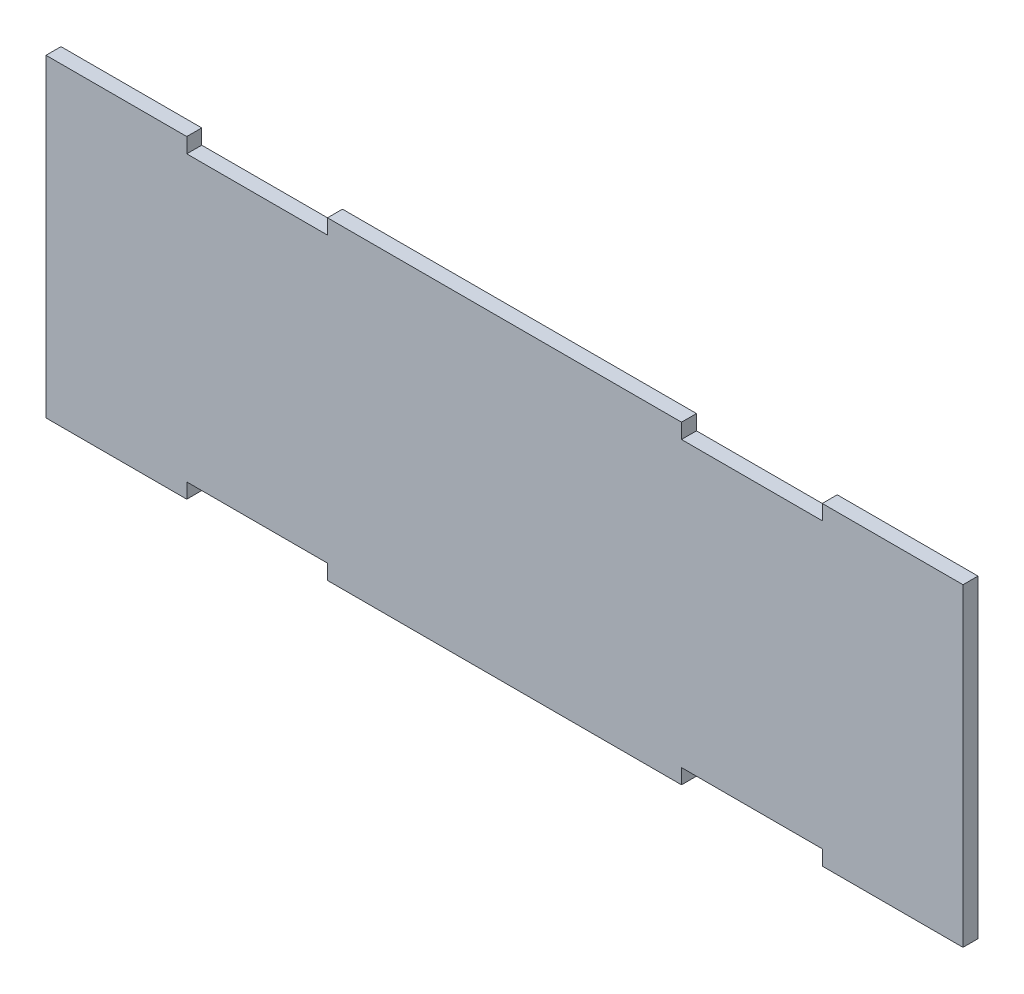
ISO-10303-21;
HEADER;
FILE_DESCRIPTION(('STEP AP214'),'2;1');
FILE_NAME('part.step','',(''),(''),'','','');
FILE_SCHEMA(('AUTOMOTIVE_DESIGN { 1 0 10303 214 1 1 1 1 }'));
ENDSEC;
DATA;
#1=APPLICATION_CONTEXT('core data for automotive mechanical design processes');
#2=APPLICATION_PROTOCOL_DEFINITION('international standard','automotive_design',2000,#1);
#3=PRODUCT_CONTEXT('',#1,'mechanical');
#4=PRODUCT('Part','Part','',(#3));
#5=PRODUCT_RELATED_PRODUCT_CATEGORY('part','',(#4));
#6=PRODUCT_DEFINITION_FORMATION('','',#4);
#7=PRODUCT_DEFINITION_CONTEXT('part definition',#1,'design');
#8=PRODUCT_DEFINITION('design','',#6,#7);
#9=PRODUCT_DEFINITION_SHAPE('','',#8);
#10=(LENGTH_UNIT() NAMED_UNIT(*) SI_UNIT(.MILLI.,.METRE.));
#11=(NAMED_UNIT(*) PLANE_ANGLE_UNIT() SI_UNIT($,.RADIAN.));
#12=(NAMED_UNIT(*) SI_UNIT($,.STERADIAN.) SOLID_ANGLE_UNIT());
#13=UNCERTAINTY_MEASURE_WITH_UNIT(LENGTH_MEASURE(1.E-05),#10,'distance_accuracy_value','');
#14=(GEOMETRIC_REPRESENTATION_CONTEXT(3) GLOBAL_UNCERTAINTY_ASSIGNED_CONTEXT((#13)) GLOBAL_UNIT_ASSIGNED_CONTEXT((#10,
#11,#12)) REPRESENTATION_CONTEXT('',''));
#15=CARTESIAN_POINT('',(0.,0.,0.));
#16=DIRECTION('',(0.,0.,1.));
#17=DIRECTION('',(1.,0.,0.));
#18=AXIS2_PLACEMENT_3D('',#15,#16,#17);
#19=CARTESIAN_POINT('',(-165.481,0.,5.4102));
#20=DIRECTION('',(-1.,0.,0.));
#21=DIRECTION('',(0.,-1.,0.));
#22=AXIS2_PLACEMENT_3D('',#19,#20,#21);
#23=PLANE('',#22);
#24=DIRECTION('',(0.,1.,0.));
#25=VECTOR('',#24,1.);
#26=CARTESIAN_POINT('',(-165.481,0.,0.));
#27=LINE('',#26,#25);
#28=CARTESIAN_POINT('',(-165.481,-56.680227,0.));
#29=VERTEX_POINT('',#28);
#30=CARTESIAN_POINT('',(-165.481,56.680227,0.));
#31=VERTEX_POINT('',#30);
#32=EDGE_CURVE('E202',#29,#31,#27,.T.);
#33=ORIENTED_EDGE('',*,*,#32,.F.);
#34=DIRECTION('',(0.,0.,-1.));
#35=VECTOR('',#34,1.);
#36=CARTESIAN_POINT('',(-165.481,-56.680227,5.4102));
#37=LINE('',#36,#35);
#38=CARTESIAN_POINT('',(-165.481,-56.680227,5.4102));
#39=VERTEX_POINT('',#38);
#40=EDGE_CURVE('E11',#39,#29,#37,.T.);
#41=ORIENTED_EDGE('',*,*,#40,.F.);
#42=DIRECTION('',(0.,1.,0.));
#43=VECTOR('',#42,1.);
#44=CARTESIAN_POINT('',(-165.481,0.,5.4102));
#45=LINE('',#44,#43);
#46=CARTESIAN_POINT('',(-165.481,56.680227,5.4102));
#47=VERTEX_POINT('',#46);
#48=EDGE_CURVE('E342',#39,#47,#45,.T.);
#49=ORIENTED_EDGE('',*,*,#48,.T.);
#50=DIRECTION('',(0.,0.,-1.));
#51=VECTOR('',#50,1.);
#52=CARTESIAN_POINT('',(-165.481,56.680227,5.4102));
#53=LINE('',#52,#51);
#54=EDGE_CURVE('E50',#47,#31,#53,.T.);
#55=ORIENTED_EDGE('',*,*,#54,.T.);
#56=EDGE_LOOP('',(#33,#41,#49,#55));
#57=FACE_BOUND('',#56,.T.);
#58=ADVANCED_FACE('F34',(#57),#23,.T.);
#59=CARTESIAN_POINT('',(0.,-56.680227,5.4102));
#60=DIRECTION('',(0.,1.,0.));
#61=DIRECTION('',(-1.,0.,0.));
#62=AXIS2_PLACEMENT_3D('',#59,#60,#61);
#63=PLANE('',#62);
#64=DIRECTION('',(1.,0.,0.));
#65=VECTOR('',#64,1.);
#66=CARTESIAN_POINT('',(0.,-56.680227,0.));
#67=LINE('',#66,#65);
#68=CARTESIAN_POINT('',(-114.681,-56.680227,0.));
#69=VERTEX_POINT('',#68);
#70=EDGE_CURVE('E204',#29,#69,#67,.T.);
#71=ORIENTED_EDGE('',*,*,#70,.T.);
#72=DIRECTION('',(0.,0.,-1.));
#73=VECTOR('',#72,1.);
#74=CARTESIAN_POINT('',(-114.681,-56.680227,5.4102));
#75=LINE('',#74,#73);
#76=CARTESIAN_POINT('',(-114.681,-56.680227,5.4102));
#77=VERTEX_POINT('',#76);
#78=EDGE_CURVE('E42',#77,#69,#75,.T.);
#79=ORIENTED_EDGE('',*,*,#78,.F.);
#80=DIRECTION('',(1.,0.,0.));
#81=VECTOR('',#80,1.);
#82=CARTESIAN_POINT('',(0.,-56.680227,5.4102));
#83=LINE('',#82,#81);
#84=EDGE_CURVE('E307',#39,#77,#83,.T.);
#85=ORIENTED_EDGE('',*,*,#84,.F.);
#86=ORIENTED_EDGE('',*,*,#40,.T.);
#87=EDGE_LOOP('',(#71,#79,#85,#86));
#88=FACE_BOUND('',#87,.T.);
#89=ADVANCED_FACE('F392',(#88),#63,.F.);
#90=CARTESIAN_POINT('',(-114.681,5.88340018331288E-13,5.4102));
#91=DIRECTION('',(-1.,0.,0.));
#92=DIRECTION('',(0.,-1.,0.));
#93=AXIS2_PLACEMENT_3D('',#90,#91,#92);
#94=PLANE('',#93);
#95=DIRECTION('',(0.,1.,0.));
#96=VECTOR('',#95,1.);
#97=CARTESIAN_POINT('',(-114.681,5.88340018331288E-13,0.));
#98=LINE('',#97,#96);
#99=CARTESIAN_POINT('',(-114.681,-51.270027,0.));
#100=VERTEX_POINT('',#99);
#101=EDGE_CURVE('E206',#69,#100,#98,.T.);
#102=ORIENTED_EDGE('',*,*,#101,.T.);
#103=DIRECTION('',(0.,0.,-1.));
#104=VECTOR('',#103,1.);
#105=CARTESIAN_POINT('',(-114.681,-51.270027,5.4102));
#106=LINE('',#105,#104);
#107=CARTESIAN_POINT('',(-114.681,-51.270027,5.4102));
#108=VERTEX_POINT('',#107);
#109=EDGE_CURVE('E279',#108,#100,#106,.T.);
#110=ORIENTED_EDGE('',*,*,#109,.F.);
#111=DIRECTION('',(0.,1.,0.));
#112=VECTOR('',#111,1.);
#113=CARTESIAN_POINT('',(-114.681,5.88340018331288E-13,5.4102));
#114=LINE('',#113,#112);
#115=EDGE_CURVE('E288',#77,#108,#114,.T.);
#116=ORIENTED_EDGE('',*,*,#115,.F.);
#117=ORIENTED_EDGE('',*,*,#78,.T.);
#118=EDGE_LOOP('',(#102,#110,#116,#117));
#119=FACE_BOUND('',#118,.T.);
#120=ADVANCED_FACE('F286',(#119),#94,.F.);
#121=CARTESIAN_POINT('',(0.,-51.270027,5.4102));
#122=DIRECTION('',(0.,1.,0.));
#123=DIRECTION('',(-1.,0.,0.));
#124=AXIS2_PLACEMENT_3D('',#121,#122,#123);
#125=PLANE('',#124);
#126=DIRECTION('',(1.,0.,0.));
#127=VECTOR('',#126,1.);
#128=CARTESIAN_POINT('',(0.,-51.270027,0.));
#129=LINE('',#128,#127);
#130=CARTESIAN_POINT('',(-63.881,-51.270027,0.));
#131=VERTEX_POINT('',#130);
#132=EDGE_CURVE('E210',#100,#131,#129,.T.);
#133=ORIENTED_EDGE('',*,*,#132,.T.);
#134=DIRECTION('',(0.,0.,-1.));
#135=VECTOR('',#134,1.);
#136=CARTESIAN_POINT('',(-63.881,-51.270027,5.4102));
#137=LINE('',#136,#135);
#138=CARTESIAN_POINT('',(-63.881,-51.270027,5.4102));
#139=VERTEX_POINT('',#138);
#140=EDGE_CURVE('E277',#139,#131,#137,.T.);
#141=ORIENTED_EDGE('',*,*,#140,.F.);
#142=DIRECTION('',(1.,0.,0.));
#143=VECTOR('',#142,1.);
#144=CARTESIAN_POINT('',(0.,-51.270027,5.4102));
#145=LINE('',#144,#143);
#146=EDGE_CURVE('E301',#108,#139,#145,.T.);
#147=ORIENTED_EDGE('',*,*,#146,.F.);
#148=ORIENTED_EDGE('',*,*,#109,.T.);
#149=EDGE_LOOP('',(#133,#141,#147,#148));
#150=FACE_BOUND('',#149,.T.);
#151=ADVANCED_FACE('F298',(#150),#125,.F.);
#152=CARTESIAN_POINT('',(-63.8809999999998,1.63862142425602E-13,5.4102));
#153=DIRECTION('',(-1.,0.,0.));
#154=DIRECTION('',(0.,-1.,0.));
#155=AXIS2_PLACEMENT_3D('',#152,#153,#154);
#156=PLANE('',#155);
#157=DIRECTION('',(0.,1.,0.));
#158=VECTOR('',#157,1.);
#159=CARTESIAN_POINT('',(-63.8809999999998,1.63862142425602E-13,0.));
#160=LINE('',#159,#158);
#161=CARTESIAN_POINT('',(-63.881,-56.680227,0.));
#162=VERTEX_POINT('',#161);
#163=EDGE_CURVE('E213',#162,#131,#160,.T.);
#164=ORIENTED_EDGE('',*,*,#163,.F.);
#165=DIRECTION('',(0.,0.,-1.));
#166=VECTOR('',#165,1.);
#167=CARTESIAN_POINT('',(-63.881,-56.680227,5.4102));
#168=LINE('',#167,#166);
#169=CARTESIAN_POINT('',(-63.881,-56.680227,5.4102));
#170=VERTEX_POINT('',#169);
#171=EDGE_CURVE('E275',#170,#162,#168,.T.);
#172=ORIENTED_EDGE('',*,*,#171,.F.);
#173=DIRECTION('',(0.,1.,0.));
#174=VECTOR('',#173,1.);
#175=CARTESIAN_POINT('',(-63.8809999999998,1.63862142425602E-13,5.4102));
#176=LINE('',#175,#174);
#177=EDGE_CURVE('E303',#170,#139,#176,.T.);
#178=ORIENTED_EDGE('',*,*,#177,.T.);
#179=ORIENTED_EDGE('',*,*,#140,.T.);
#180=EDGE_LOOP('',(#164,#172,#178,#179));
#181=FACE_BOUND('',#180,.T.);
#182=ADVANCED_FACE('F384',(#181),#156,.T.);
#183=CARTESIAN_POINT('',(63.881,-56.680227,0.));
#184=VERTEX_POINT('',#183);
#185=EDGE_CURVE('E208',#162,#184,#67,.T.);
#186=ORIENTED_EDGE('',*,*,#185,.T.);
#187=DIRECTION('',(0.,0.,-1.));
#188=VECTOR('',#187,1.);
#189=CARTESIAN_POINT('',(63.881,-56.680227,5.4102));
#190=LINE('',#189,#188);
#191=CARTESIAN_POINT('',(63.881,-56.680227,5.4102));
#192=VERTEX_POINT('',#191);
#193=EDGE_CURVE('E272',#192,#184,#190,.T.);
#194=ORIENTED_EDGE('',*,*,#193,.F.);
#195=EDGE_CURVE('E305',#170,#192,#83,.T.);
#196=ORIENTED_EDGE('',*,*,#195,.F.);
#197=ORIENTED_EDGE('',*,*,#171,.T.);
#198=EDGE_LOOP('',(#186,#194,#196,#197));
#199=FACE_BOUND('',#198,.T.);
#200=ADVANCED_FACE('F349',(#199),#63,.F.);
#201=CARTESIAN_POINT('',(63.8809999999998,1.63862142425603E-13,5.4102));
#202=DIRECTION('',(-1.,0.,0.));
#203=DIRECTION('',(0.,-1.,0.));
#204=AXIS2_PLACEMENT_3D('',#201,#202,#203);
#205=PLANE('',#204);
#206=DIRECTION('',(0.,1.,0.));
#207=VECTOR('',#206,1.);
#208=CARTESIAN_POINT('',(63.8809999999998,1.63862142425603E-13,0.));
#209=LINE('',#208,#207);
#210=CARTESIAN_POINT('',(63.881,-51.270027,0.));
#211=VERTEX_POINT('',#210);
#212=EDGE_CURVE('E216',#184,#211,#209,.T.);
#213=ORIENTED_EDGE('',*,*,#212,.T.);
#214=DIRECTION('',(0.,0.,-1.));
#215=VECTOR('',#214,1.);
#216=CARTESIAN_POINT('',(63.881,-51.270027,5.4102));
#217=LINE('',#216,#215);
#218=CARTESIAN_POINT('',(63.881,-51.270027,5.4102));
#219=VERTEX_POINT('',#218);
#220=EDGE_CURVE('E269',#219,#211,#217,.T.);
#221=ORIENTED_EDGE('',*,*,#220,.F.);
#222=DIRECTION('',(0.,1.,0.));
#223=VECTOR('',#222,1.);
#224=CARTESIAN_POINT('',(63.8809999999998,1.63862142425603E-13,5.4102));
#225=LINE('',#224,#223);
#226=EDGE_CURVE('E311',#192,#219,#225,.T.);
#227=ORIENTED_EDGE('',*,*,#226,.F.);
#228=ORIENTED_EDGE('',*,*,#193,.T.);
#229=EDGE_LOOP('',(#213,#221,#227,#228));
#230=FACE_BOUND('',#229,.T.);
#231=ADVANCED_FACE('F352',(#230),#205,.F.);
#232=CARTESIAN_POINT('',(0.,-51.270027,5.4102));
#233=DIRECTION('',(0.,1.,0.));
#234=DIRECTION('',(-1.,0.,0.));
#235=AXIS2_PLACEMENT_3D('',#232,#233,#234);
#236=PLANE('',#235);
#237=DIRECTION('',(1.,0.,0.));
#238=VECTOR('',#237,1.);
#239=CARTESIAN_POINT('',(0.,-51.270027,0.));
#240=LINE('',#239,#238);
#241=CARTESIAN_POINT('',(114.681,-51.270027,0.));
#242=VERTEX_POINT('',#241);
#243=EDGE_CURVE('E218',#211,#242,#240,.T.);
#244=ORIENTED_EDGE('',*,*,#243,.T.);
#245=DIRECTION('',(0.,0.,-1.));
#246=VECTOR('',#245,1.);
#247=CARTESIAN_POINT('',(114.681,-51.270027,5.4102));
#248=LINE('',#247,#246);
#249=CARTESIAN_POINT('',(114.681,-51.270027,5.4102));
#250=VERTEX_POINT('',#249);
#251=EDGE_CURVE('E267',#250,#242,#248,.T.);
#252=ORIENTED_EDGE('',*,*,#251,.F.);
#253=DIRECTION('',(1.,0.,0.));
#254=VECTOR('',#253,1.);
#255=CARTESIAN_POINT('',(0.,-51.270027,5.4102));
#256=LINE('',#255,#254);
#257=EDGE_CURVE('E313',#219,#250,#256,.T.);
#258=ORIENTED_EDGE('',*,*,#257,.F.);
#259=ORIENTED_EDGE('',*,*,#220,.T.);
#260=EDGE_LOOP('',(#244,#252,#258,#259));
#261=FACE_BOUND('',#260,.T.);
#262=ADVANCED_FACE('F357',(#261),#236,.F.);
#263=CARTESIAN_POINT('',(114.681,2.94170009165644E-13,5.4102));
#264=DIRECTION('',(-1.,0.,0.));
#265=DIRECTION('',(0.,-1.,0.));
#266=AXIS2_PLACEMENT_3D('',#263,#264,#265);
#267=PLANE('',#266);
#268=DIRECTION('',(0.,1.,0.));
#269=VECTOR('',#268,1.);
#270=CARTESIAN_POINT('',(114.681,2.94170009165644E-13,0.));
#271=LINE('',#270,#269);
#272=CARTESIAN_POINT('',(114.681,-56.680227,0.));
#273=VERTEX_POINT('',#272);
#274=EDGE_CURVE('E221',#273,#242,#271,.T.);
#275=ORIENTED_EDGE('',*,*,#274,.F.);
#276=DIRECTION('',(0.,0.,-1.));
#277=VECTOR('',#276,1.);
#278=CARTESIAN_POINT('',(114.681,-56.680227,5.4102));
#279=LINE('',#278,#277);
#280=CARTESIAN_POINT('',(114.681,-56.680227,5.4102));
#281=VERTEX_POINT('',#280);
#282=EDGE_CURVE('E265',#281,#273,#279,.T.);
#283=ORIENTED_EDGE('',*,*,#282,.F.);
#284=DIRECTION('',(0.,1.,0.));
#285=VECTOR('',#284,1.);
#286=CARTESIAN_POINT('',(114.681,2.94170009165644E-13,5.4102));
#287=LINE('',#286,#285);
#288=EDGE_CURVE('E315',#281,#250,#287,.T.);
#289=ORIENTED_EDGE('',*,*,#288,.T.);
#290=ORIENTED_EDGE('',*,*,#251,.T.);
#291=EDGE_LOOP('',(#275,#283,#289,#290));
#292=FACE_BOUND('',#291,.T.);
#293=ADVANCED_FACE('F363',(#292),#267,.T.);
#294=CARTESIAN_POINT('',(165.481,-56.680227,0.));
#295=VERTEX_POINT('',#294);
#296=EDGE_CURVE('E207',#273,#295,#67,.T.);
#297=ORIENTED_EDGE('',*,*,#296,.T.);
#298=DIRECTION('',(0.,0.,-1.));
#299=VECTOR('',#298,1.);
#300=CARTESIAN_POINT('',(165.481,-56.680227,5.4102));
#301=LINE('',#300,#299);
#302=CARTESIAN_POINT('',(165.481,-56.680227,5.4102));
#303=VERTEX_POINT('',#302);
#304=EDGE_CURVE('E262',#303,#295,#301,.T.);
#305=ORIENTED_EDGE('',*,*,#304,.F.);
#306=EDGE_CURVE('E318',#281,#303,#83,.T.);
#307=ORIENTED_EDGE('',*,*,#306,.F.);
#308=ORIENTED_EDGE('',*,*,#282,.T.);
#309=EDGE_LOOP('',(#297,#305,#307,#308));
#310=FACE_BOUND('',#309,.T.);
#311=ADVANCED_FACE('F366',(#310),#63,.F.);
#312=CARTESIAN_POINT('',(165.481,0.,5.4102));
#313=DIRECTION('',(-1.,0.,0.));
#314=DIRECTION('',(0.,-1.,0.));
#315=AXIS2_PLACEMENT_3D('',#312,#313,#314);
#316=PLANE('',#315);
#317=DIRECTION('',(0.,1.,0.));
#318=VECTOR('',#317,1.);
#319=CARTESIAN_POINT('',(165.481,0.,0.));
#320=LINE('',#319,#318);
#321=CARTESIAN_POINT('',(165.481,56.680227,0.));
#322=VERTEX_POINT('',#321);
#323=EDGE_CURVE('E224',#295,#322,#320,.T.);
#324=ORIENTED_EDGE('',*,*,#323,.T.);
#325=DIRECTION('',(0.,0.,-1.));
#326=VECTOR('',#325,1.);
#327=CARTESIAN_POINT('',(165.481,56.680227,5.4102));
#328=LINE('',#327,#326);
#329=CARTESIAN_POINT('',(165.481,56.680227,5.4102));
#330=VERTEX_POINT('',#329);
#331=EDGE_CURVE('E260',#330,#322,#328,.T.);
#332=ORIENTED_EDGE('',*,*,#331,.F.);
#333=DIRECTION('',(0.,1.,0.));
#334=VECTOR('',#333,1.);
#335=CARTESIAN_POINT('',(165.481,0.,5.4102));
#336=LINE('',#335,#334);
#337=EDGE_CURVE('E319',#303,#330,#336,.T.);
#338=ORIENTED_EDGE('',*,*,#337,.F.);
#339=ORIENTED_EDGE('',*,*,#304,.T.);
#340=EDGE_LOOP('',(#324,#332,#338,#339));
#341=FACE_BOUND('',#340,.T.);
#342=ADVANCED_FACE('F371',(#341),#316,.F.);
#343=CARTESIAN_POINT('',(0.,56.680227,5.4102));
#344=DIRECTION('',(0.,1.,0.));
#345=DIRECTION('',(0.,0.,1.));
#346=AXIS2_PLACEMENT_3D('',#343,#344,#345);
#347=PLANE('',#346);
#348=DIRECTION('',(1.,0.,0.));
#349=VECTOR('',#348,1.);
#350=CARTESIAN_POINT('',(0.,56.680227,0.));
#351=LINE('',#350,#349);
#352=CARTESIAN_POINT('',(114.681,56.680227,0.));
#353=VERTEX_POINT('',#352);
#354=EDGE_CURVE('E227',#353,#322,#351,.T.);
#355=ORIENTED_EDGE('',*,*,#354,.F.);
#356=DIRECTION('',(0.,0.,-1.));
#357=VECTOR('',#356,1.);
#358=CARTESIAN_POINT('',(114.681,56.680227,5.4102));
#359=LINE('',#358,#357);
#360=CARTESIAN_POINT('',(114.681,56.680227,5.4102));
#361=VERTEX_POINT('',#360);
#362=EDGE_CURVE('E258',#361,#353,#359,.T.);
#363=ORIENTED_EDGE('',*,*,#362,.F.);
#364=DIRECTION('',(1.,0.,0.));
#365=VECTOR('',#364,1.);
#366=CARTESIAN_POINT('',(0.,56.680227,5.4102));
#367=LINE('',#366,#365);
#368=EDGE_CURVE('E199',#361,#330,#367,.T.);
#369=ORIENTED_EDGE('',*,*,#368,.T.);
#370=ORIENTED_EDGE('',*,*,#331,.T.);
#371=EDGE_LOOP('',(#355,#363,#369,#370));
#372=FACE_BOUND('',#371,.T.);
#373=ADVANCED_FACE('F377',(#372),#347,.T.);
#374=CARTESIAN_POINT('',(114.681,-2.94170009165644E-13,5.4102));
#375=DIRECTION('',(1.,0.,0.));
#376=DIRECTION('',(0.,1.,0.));
#377=AXIS2_PLACEMENT_3D('',#374,#375,#376);
#378=PLANE('',#377);
#379=DIRECTION('',(0.,-1.,0.));
#380=VECTOR('',#379,1.);
#381=CARTESIAN_POINT('',(114.681,-2.94170009165644E-13,0.));
#382=LINE('',#381,#380);
#383=CARTESIAN_POINT('',(114.681,51.270027,0.));
#384=VERTEX_POINT('',#383);
#385=EDGE_CURVE('E230',#353,#384,#382,.T.);
#386=ORIENTED_EDGE('',*,*,#385,.T.);
#387=DIRECTION('',(0.,0.,-1.));
#388=VECTOR('',#387,1.);
#389=CARTESIAN_POINT('',(114.681,51.270027,5.4102));
#390=LINE('',#389,#388);
#391=CARTESIAN_POINT('',(114.681,51.270027,5.4102));
#392=VERTEX_POINT('',#391);
#393=EDGE_CURVE('E256',#392,#384,#390,.T.);
#394=ORIENTED_EDGE('',*,*,#393,.F.);
#395=DIRECTION('',(0.,-1.,0.));
#396=VECTOR('',#395,1.);
#397=CARTESIAN_POINT('',(114.681,-2.94170009165644E-13,5.4102));
#398=LINE('',#397,#396);
#399=EDGE_CURVE('E322',#361,#392,#398,.T.);
#400=ORIENTED_EDGE('',*,*,#399,.F.);
#401=ORIENTED_EDGE('',*,*,#362,.T.);
#402=EDGE_LOOP('',(#386,#394,#400,#401));
#403=FACE_BOUND('',#402,.T.);
#404=ADVANCED_FACE('F380',(#403),#378,.F.);
#405=CARTESIAN_POINT('',(0.,51.270027,5.4102));
#406=DIRECTION('',(0.,1.,0.));
#407=DIRECTION('',(-1.,0.,0.));
#408=AXIS2_PLACEMENT_3D('',#405,#406,#407);
#409=PLANE('',#408);
#410=DIRECTION('',(1.,0.,0.));
#411=VECTOR('',#410,1.);
#412=CARTESIAN_POINT('',(0.,51.270027,0.));
#413=LINE('',#412,#411);
#414=CARTESIAN_POINT('',(63.881,51.270027,0.));
#415=VERTEX_POINT('',#414);
#416=EDGE_CURVE('E235',#415,#384,#413,.T.);
#417=ORIENTED_EDGE('',*,*,#416,.F.);
#418=DIRECTION('',(0.,0.,-1.));
#419=VECTOR('',#418,1.);
#420=CARTESIAN_POINT('',(63.881,51.270027,5.4102));
#421=LINE('',#420,#419);
#422=CARTESIAN_POINT('',(63.881,51.270027,5.4102));
#423=VERTEX_POINT('',#422);
#424=EDGE_CURVE('E254',#423,#415,#421,.T.);
#425=ORIENTED_EDGE('',*,*,#424,.F.);
#426=DIRECTION('',(1.,0.,0.));
#427=VECTOR('',#426,1.);
#428=CARTESIAN_POINT('',(0.,51.270027,5.4102));
#429=LINE('',#428,#427);
#430=EDGE_CURVE('E324',#423,#392,#429,.T.);
#431=ORIENTED_EDGE('',*,*,#430,.T.);
#432=ORIENTED_EDGE('',*,*,#393,.T.);
#433=EDGE_LOOP('',(#417,#425,#431,#432));
#434=FACE_BOUND('',#433,.T.);
#435=ADVANCED_FACE('F382',(#434),#409,.T.);
#436=CARTESIAN_POINT('',(63.8809999999998,-1.63862142425603E-13,5.4102));
#437=DIRECTION('',(1.,0.,0.));
#438=DIRECTION('',(0.,1.,0.));
#439=AXIS2_PLACEMENT_3D('',#436,#437,#438);
#440=PLANE('',#439);
#441=DIRECTION('',(0.,-1.,0.));
#442=VECTOR('',#441,1.);
#443=CARTESIAN_POINT('',(63.8809999999998,-1.63862142425603E-13,0.));
#444=LINE('',#443,#442);
#445=CARTESIAN_POINT('',(63.881,56.680227,0.));
#446=VERTEX_POINT('',#445);
#447=EDGE_CURVE('E238',#446,#415,#444,.T.);
#448=ORIENTED_EDGE('',*,*,#447,.F.);
#449=DIRECTION('',(0.,0.,-1.));
#450=VECTOR('',#449,1.);
#451=CARTESIAN_POINT('',(63.881,56.680227,5.4102));
#452=LINE('',#451,#450);
#453=CARTESIAN_POINT('',(63.881,56.680227,5.4102));
#454=VERTEX_POINT('',#453);
#455=EDGE_CURVE('E252',#454,#446,#452,.T.);
#456=ORIENTED_EDGE('',*,*,#455,.F.);
#457=DIRECTION('',(0.,-1.,0.));
#458=VECTOR('',#457,1.);
#459=CARTESIAN_POINT('',(63.8809999999998,-1.63862142425603E-13,5.4102));
#460=LINE('',#459,#458);
#461=EDGE_CURVE('E327',#454,#423,#460,.T.);
#462=ORIENTED_EDGE('',*,*,#461,.T.);
#463=ORIENTED_EDGE('',*,*,#424,.T.);
#464=EDGE_LOOP('',(#448,#456,#462,#463));
#465=FACE_BOUND('',#464,.T.);
#466=ADVANCED_FACE('F337',(#465),#440,.T.);
#467=CARTESIAN_POINT('',(-63.881,56.680227,0.));
#468=VERTEX_POINT('',#467);
#469=EDGE_CURVE('E232',#468,#446,#351,.T.);
#470=ORIENTED_EDGE('',*,*,#469,.F.);
#471=DIRECTION('',(0.,0.,-1.));
#472=VECTOR('',#471,1.);
#473=CARTESIAN_POINT('',(-63.881,56.680227,5.4102));
#474=LINE('',#473,#472);
#475=CARTESIAN_POINT('',(-63.881,56.680227,5.4102));
#476=VERTEX_POINT('',#475);
#477=EDGE_CURVE('E250',#476,#468,#474,.T.);
#478=ORIENTED_EDGE('',*,*,#477,.F.);
#479=EDGE_CURVE('E198',#476,#454,#367,.T.);
#480=ORIENTED_EDGE('',*,*,#479,.T.);
#481=ORIENTED_EDGE('',*,*,#455,.T.);
#482=EDGE_LOOP('',(#470,#478,#480,#481));
#483=FACE_BOUND('',#482,.T.);
#484=ADVANCED_FACE('F332',(#483),#347,.T.);
#485=CARTESIAN_POINT('',(-63.881,0.,5.4102));
#486=DIRECTION('',(1.,0.,0.));
#487=DIRECTION('',(0.,0.,-1.));
#488=AXIS2_PLACEMENT_3D('',#485,#486,#487);
#489=PLANE('',#488);
#490=DIRECTION('',(0.,-1.,0.));
#491=VECTOR('',#490,1.);
#492=CARTESIAN_POINT('',(-63.881,0.,0.));
#493=LINE('',#492,#491);
#494=CARTESIAN_POINT('',(-63.881,51.270027,0.));
#495=VERTEX_POINT('',#494);
#496=EDGE_CURVE('E241',#468,#495,#493,.T.);
#497=ORIENTED_EDGE('',*,*,#496,.T.);
#498=DIRECTION('',(0.,0.,-1.));
#499=VECTOR('',#498,1.);
#500=CARTESIAN_POINT('',(-63.881,51.270027,5.4102));
#501=LINE('',#500,#499);
#502=CARTESIAN_POINT('',(-63.881,51.270027,5.4102));
#503=VERTEX_POINT('',#502);
#504=EDGE_CURVE('E181',#503,#495,#501,.T.);
#505=ORIENTED_EDGE('',*,*,#504,.F.);
#506=DIRECTION('',(0.,-1.,0.));
#507=VECTOR('',#506,1.);
#508=CARTESIAN_POINT('',(-63.881,0.,5.4102));
#509=LINE('',#508,#507);
#510=EDGE_CURVE('E191',#476,#503,#509,.T.);
#511=ORIENTED_EDGE('',*,*,#510,.F.);
#512=ORIENTED_EDGE('',*,*,#477,.T.);
#513=EDGE_LOOP('',(#497,#505,#511,#512));
#514=FACE_BOUND('',#513,.T.);
#515=ADVANCED_FACE('F411',(#514),#489,.F.);
#516=CARTESIAN_POINT('',(0.,51.270027,5.4102));
#517=DIRECTION('',(0.,1.,0.));
#518=DIRECTION('',(-1.,0.,0.));
#519=AXIS2_PLACEMENT_3D('',#516,#517,#518);
#520=PLANE('',#519);
#521=DIRECTION('',(1.,0.,0.));
#522=VECTOR('',#521,1.);
#523=CARTESIAN_POINT('',(0.,51.270027,0.));
#524=LINE('',#523,#522);
#525=CARTESIAN_POINT('',(-114.681,51.270027,0.));
#526=VERTEX_POINT('',#525);
#527=EDGE_CURVE('E177',#526,#495,#524,.T.);
#528=ORIENTED_EDGE('',*,*,#527,.F.);
#529=DIRECTION('',(0.,0.,-1.));
#530=VECTOR('',#529,1.);
#531=CARTESIAN_POINT('',(-114.681,51.270027,5.4102));
#532=LINE('',#531,#530);
#533=CARTESIAN_POINT('',(-114.681,51.270027,5.4102));
#534=VERTEX_POINT('',#533);
#535=EDGE_CURVE('E172',#534,#526,#532,.T.);
#536=ORIENTED_EDGE('',*,*,#535,.F.);
#537=DIRECTION('',(1.,0.,0.));
#538=VECTOR('',#537,1.);
#539=CARTESIAN_POINT('',(0.,51.270027,5.4102));
#540=LINE('',#539,#538);
#541=EDGE_CURVE('E175',#534,#503,#540,.T.);
#542=ORIENTED_EDGE('',*,*,#541,.T.);
#543=ORIENTED_EDGE('',*,*,#504,.T.);
#544=EDGE_LOOP('',(#528,#536,#542,#543));
#545=FACE_BOUND('',#544,.T.);
#546=ADVANCED_FACE('F174',(#545),#520,.T.);
#547=CARTESIAN_POINT('',(-114.681,0.,5.4102));
#548=DIRECTION('',(1.,0.,0.));
#549=DIRECTION('',(0.,0.,-1.));
#550=AXIS2_PLACEMENT_3D('',#547,#548,#549);
#551=PLANE('',#550);
#552=DIRECTION('',(0.,-1.,0.));
#553=VECTOR('',#552,1.);
#554=CARTESIAN_POINT('',(-114.681,0.,0.));
#555=LINE('',#554,#553);
#556=CARTESIAN_POINT('',(-114.681,56.680227,0.));
#557=VERTEX_POINT('',#556);
#558=EDGE_CURVE('E245',#557,#526,#555,.T.);
#559=ORIENTED_EDGE('',*,*,#558,.F.);
#560=DIRECTION('',(0.,0.,-1.));
#561=VECTOR('',#560,1.);
#562=CARTESIAN_POINT('',(-114.681,56.680227,5.4102));
#563=LINE('',#562,#561);
#564=CARTESIAN_POINT('',(-114.681,56.680227,5.4102));
#565=VERTEX_POINT('',#564);
#566=EDGE_CURVE('E111',#565,#557,#563,.T.);
#567=ORIENTED_EDGE('',*,*,#566,.F.);
#568=DIRECTION('',(0.,-1.,0.));
#569=VECTOR('',#568,1.);
#570=CARTESIAN_POINT('',(-114.681,0.,5.4102));
#571=LINE('',#570,#569);
#572=EDGE_CURVE('E188',#565,#534,#571,.T.);
#573=ORIENTED_EDGE('',*,*,#572,.T.);
#574=ORIENTED_EDGE('',*,*,#535,.T.);
#575=EDGE_LOOP('',(#559,#567,#573,#574));
#576=FACE_BOUND('',#575,.T.);
#577=ADVANCED_FACE('F194',(#576),#551,.T.);
#578=EDGE_CURVE('E231',#31,#557,#351,.T.);
#579=ORIENTED_EDGE('',*,*,#578,.F.);
#580=ORIENTED_EDGE('',*,*,#54,.F.);
#581=EDGE_CURVE('E195',#47,#565,#367,.T.);
#582=ORIENTED_EDGE('',*,*,#581,.T.);
#583=ORIENTED_EDGE('',*,*,#566,.T.);
#584=EDGE_LOOP('',(#579,#580,#582,#583));
#585=FACE_BOUND('',#584,.T.);
#586=ADVANCED_FACE('F399',(#585),#347,.T.);
#587=CARTESIAN_POINT('',(0.,0.,5.4102));
#588=DIRECTION('',(0.,0.,1.));
#589=DIRECTION('',(1.,0.,0.));
#590=AXIS2_PLACEMENT_3D('',#587,#588,#589);
#591=PLANE('',#590);
#592=ORIENTED_EDGE('',*,*,#48,.F.);
#593=ORIENTED_EDGE('',*,*,#84,.T.);
#594=ORIENTED_EDGE('',*,*,#115,.T.);
#595=ORIENTED_EDGE('',*,*,#146,.T.);
#596=ORIENTED_EDGE('',*,*,#177,.F.);
#597=ORIENTED_EDGE('',*,*,#195,.T.);
#598=ORIENTED_EDGE('',*,*,#226,.T.);
#599=ORIENTED_EDGE('',*,*,#257,.T.);
#600=ORIENTED_EDGE('',*,*,#288,.F.);
#601=ORIENTED_EDGE('',*,*,#306,.T.);
#602=ORIENTED_EDGE('',*,*,#337,.T.);
#603=ORIENTED_EDGE('',*,*,#368,.F.);
#604=ORIENTED_EDGE('',*,*,#399,.T.);
#605=ORIENTED_EDGE('',*,*,#430,.F.);
#606=ORIENTED_EDGE('',*,*,#461,.F.);
#607=ORIENTED_EDGE('',*,*,#479,.F.);
#608=ORIENTED_EDGE('',*,*,#510,.T.);
#609=ORIENTED_EDGE('',*,*,#541,.F.);
#610=ORIENTED_EDGE('',*,*,#572,.F.);
#611=ORIENTED_EDGE('',*,*,#581,.F.);
#612=EDGE_LOOP('',(#592,#593,#594,#595,#596,#597,#598,#599,#600,#601,#602,#603,#604,#605,#606,
#607,#608,#609,#610,#611));
#613=FACE_BOUND('',#612,.T.);
#614=ADVANCED_FACE('F186',(#613),#591,.T.);
#615=CARTESIAN_POINT('',(0.,0.,0.));
#616=DIRECTION('',(0.,0.,1.));
#617=DIRECTION('',(1.,0.,0.));
#618=AXIS2_PLACEMENT_3D('',#615,#616,#617);
#619=PLANE('',#618);
#620=ORIENTED_EDGE('',*,*,#32,.T.);
#621=ORIENTED_EDGE('',*,*,#578,.T.);
#622=ORIENTED_EDGE('',*,*,#558,.T.);
#623=ORIENTED_EDGE('',*,*,#527,.T.);
#624=ORIENTED_EDGE('',*,*,#496,.F.);
#625=ORIENTED_EDGE('',*,*,#469,.T.);
#626=ORIENTED_EDGE('',*,*,#447,.T.);
#627=ORIENTED_EDGE('',*,*,#416,.T.);
#628=ORIENTED_EDGE('',*,*,#385,.F.);
#629=ORIENTED_EDGE('',*,*,#354,.T.);
#630=ORIENTED_EDGE('',*,*,#323,.F.);
#631=ORIENTED_EDGE('',*,*,#296,.F.);
#632=ORIENTED_EDGE('',*,*,#274,.T.);
#633=ORIENTED_EDGE('',*,*,#243,.F.);
#634=ORIENTED_EDGE('',*,*,#212,.F.);
#635=ORIENTED_EDGE('',*,*,#185,.F.);
#636=ORIENTED_EDGE('',*,*,#163,.T.);
#637=ORIENTED_EDGE('',*,*,#132,.F.);
#638=ORIENTED_EDGE('',*,*,#101,.F.);
#639=ORIENTED_EDGE('',*,*,#70,.F.);
#640=EDGE_LOOP('',(#620,#621,#622,#623,#624,#625,#626,#627,#628,#629,#630,#631,#632,#633,#634,
#635,#636,#637,#638,#639));
#641=FACE_BOUND('',#640,.T.);
#642=ADVANCED_FACE('F293',(#641),#619,.F.);
#643=CLOSED_SHELL('',(#58,#89,#120,#151,#182,#200,#231,#262,#293,#311,#342,#373,#404,#435,#466,
#484,#515,#546,#577,#586,#614,#642));
#644=MANIFOLD_SOLID_BREP('B2',#643);
#645=ADVANCED_BREP_SHAPE_REPRESENTATION('',(#18,#644),#14);
#646=SHAPE_DEFINITION_REPRESENTATION(#9,#645);
ENDSEC;
END-ISO-10303-21;
